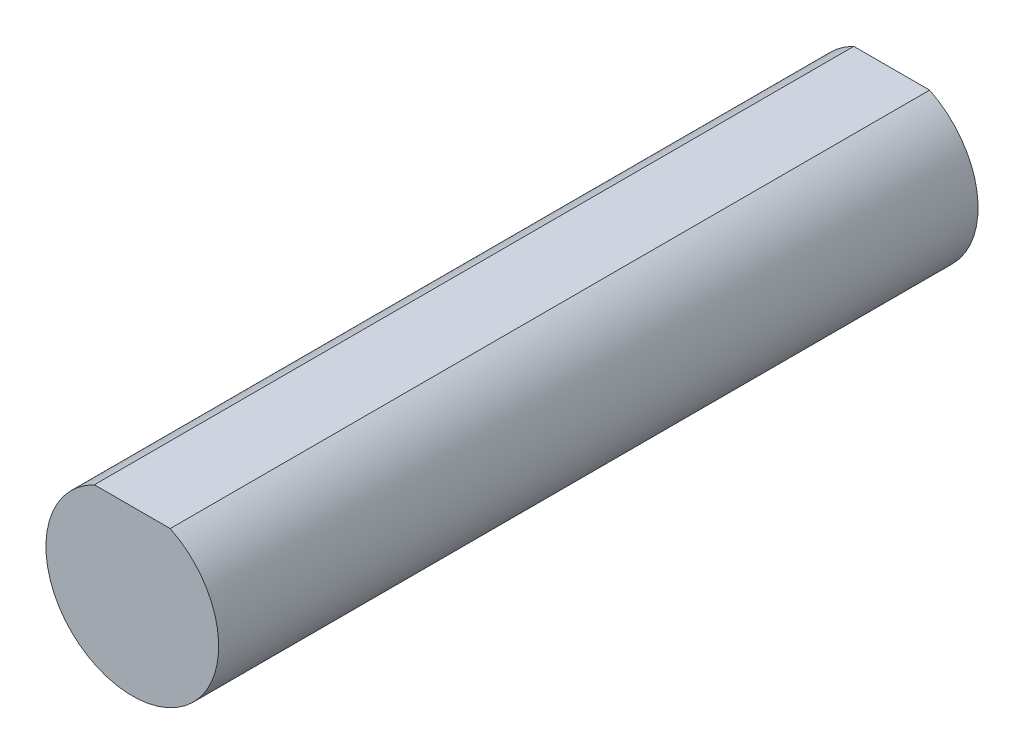
ISO-10303-21;
HEADER;
FILE_DESCRIPTION(('STEP AP214'),'2;1');
FILE_NAME('part.step','',(''),(''),'','','');
FILE_SCHEMA(('AUTOMOTIVE_DESIGN { 1 0 10303 214 1 1 1 1 }'));
ENDSEC;
DATA;
#1=APPLICATION_CONTEXT('core data for automotive mechanical design processes');
#2=APPLICATION_PROTOCOL_DEFINITION('international standard','automotive_design',2000,#1);
#3=PRODUCT_CONTEXT('',#1,'mechanical');
#4=PRODUCT('Part','Part','',(#3));
#5=PRODUCT_RELATED_PRODUCT_CATEGORY('part','',(#4));
#6=PRODUCT_DEFINITION_FORMATION('','',#4);
#7=PRODUCT_DEFINITION_CONTEXT('part definition',#1,'design');
#8=PRODUCT_DEFINITION('design','',#6,#7);
#9=PRODUCT_DEFINITION_SHAPE('','',#8);
#10=(LENGTH_UNIT() NAMED_UNIT(*) SI_UNIT(.MILLI.,.METRE.));
#11=(NAMED_UNIT(*) PLANE_ANGLE_UNIT() SI_UNIT($,.RADIAN.));
#12=(NAMED_UNIT(*) SI_UNIT($,.STERADIAN.) SOLID_ANGLE_UNIT());
#13=UNCERTAINTY_MEASURE_WITH_UNIT(LENGTH_MEASURE(1.E-05),#10,'distance_accuracy_value','');
#14=(GEOMETRIC_REPRESENTATION_CONTEXT(3) GLOBAL_UNCERTAINTY_ASSIGNED_CONTEXT((#13)) GLOBAL_UNIT_ASSIGNED_CONTEXT((#10,
#11,#12)) REPRESENTATION_CONTEXT('',''));
#15=CARTESIAN_POINT('',(0.,0.,0.));
#16=DIRECTION('',(0.,0.,1.));
#17=DIRECTION('',(1.,0.,0.));
#18=AXIS2_PLACEMENT_3D('',#15,#16,#17);
#19=CARTESIAN_POINT('',(0.,0.,21.9964));
#20=DIRECTION('',(0.,0.,-1.));
#21=DIRECTION('',(-1.,0.,0.));
#22=AXIS2_PLACEMENT_3D('',#19,#20,#21);
#23=CYLINDRICAL_SURFACE('',#22,2.5019);
#24=CARTESIAN_POINT('',(0.,0.,21.9964));
#25=DIRECTION('',(0.,0.,1.));
#26=DIRECTION('',(1.,0.,0.));
#27=AXIS2_PLACEMENT_3D('',#24,#25,#26);
#28=CIRCLE('',#27,2.5019);
#29=CARTESIAN_POINT('',(-1.09838481417034,2.2479,21.9964));
#30=VERTEX_POINT('',#29);
#31=CARTESIAN_POINT('',(1.09838481417034,2.2479,21.9964));
#32=VERTEX_POINT('',#31);
#33=EDGE_CURVE('E11',#30,#32,#28,.T.);
#34=ORIENTED_EDGE('',*,*,#33,.F.);
#35=DIRECTION('',(0.,0.,1.));
#36=VECTOR('',#35,1.);
#37=CARTESIAN_POINT('',(-1.09838481417034,2.2479,0.));
#38=LINE('',#37,#36);
#39=CARTESIAN_POINT('',(-1.09838481417034,2.2479,0.));
#40=VERTEX_POINT('',#39);
#41=EDGE_CURVE('E64',#40,#30,#38,.T.);
#42=ORIENTED_EDGE('',*,*,#41,.F.);
#43=CARTESIAN_POINT('',(0.,0.,0.));
#44=DIRECTION('',(0.,0.,1.));
#45=DIRECTION('',(1.,0.,0.));
#46=AXIS2_PLACEMENT_3D('',#43,#44,#45);
#47=CIRCLE('',#46,2.5019);
#48=CARTESIAN_POINT('',(1.09838481417034,2.2479,0.));
#49=VERTEX_POINT('',#48);
#50=EDGE_CURVE('E44',#40,#49,#47,.T.);
#51=ORIENTED_EDGE('',*,*,#50,.T.);
#52=DIRECTION('',(0.,0.,1.));
#53=VECTOR('',#52,1.);
#54=CARTESIAN_POINT('',(1.09838481417034,2.2479,0.));
#55=LINE('',#54,#53);
#56=EDGE_CURVE('E55',#49,#32,#55,.T.);
#57=ORIENTED_EDGE('',*,*,#56,.T.);
#58=EDGE_LOOP('',(#34,#42,#51,#57));
#59=FACE_BOUND('',#58,.T.);
#60=ADVANCED_FACE('F41',(#59),#23,.T.);
#61=CARTESIAN_POINT('',(0.,0.,21.9964));
#62=DIRECTION('',(0.,0.,1.));
#63=DIRECTION('',(1.,0.,0.));
#64=AXIS2_PLACEMENT_3D('',#61,#62,#63);
#65=PLANE('',#64);
#66=DIRECTION('',(1.,0.,0.));
#67=VECTOR('',#66,1.);
#68=CARTESIAN_POINT('',(-1.09838481417034,2.2479,21.9964));
#69=LINE('',#68,#67);
#70=EDGE_CURVE('E67',#30,#32,#69,.T.);
#71=ORIENTED_EDGE('',*,*,#70,.F.);
#72=ORIENTED_EDGE('',*,*,#33,.T.);
#73=EDGE_LOOP('',(#71,#72));
#74=FACE_BOUND('',#73,.T.);
#75=ADVANCED_FACE('F74',(#74),#65,.T.);
#76=CARTESIAN_POINT('',(0.,0.,0.));
#77=DIRECTION('',(0.,0.,1.));
#78=DIRECTION('',(1.,0.,0.));
#79=AXIS2_PLACEMENT_3D('',#76,#77,#78);
#80=PLANE('',#79);
#81=ORIENTED_EDGE('',*,*,#50,.F.);
#82=DIRECTION('',(1.,0.,0.));
#83=VECTOR('',#82,1.);
#84=CARTESIAN_POINT('',(-1.09838481417034,2.2479,0.));
#85=LINE('',#84,#83);
#86=EDGE_CURVE('E60',#40,#49,#85,.T.);
#87=ORIENTED_EDGE('',*,*,#86,.T.);
#88=EDGE_LOOP('',(#81,#87));
#89=FACE_BOUND('',#88,.T.);
#90=ADVANCED_FACE('F79',(#89),#80,.F.);
#91=CARTESIAN_POINT('',(-1.09838481417034,2.2479,0.));
#92=DIRECTION('',(0.,-1.,0.));
#93=DIRECTION('',(0.,0.,-1.));
#94=AXIS2_PLACEMENT_3D('',#91,#92,#93);
#95=PLANE('',#94);
#96=ORIENTED_EDGE('',*,*,#70,.T.);
#97=ORIENTED_EDGE('',*,*,#56,.F.);
#98=ORIENTED_EDGE('',*,*,#86,.F.);
#99=ORIENTED_EDGE('',*,*,#41,.T.);
#100=EDGE_LOOP('',(#96,#97,#98,#99));
#101=FACE_BOUND('',#100,.T.);
#102=ADVANCED_FACE('F66',(#101),#95,.F.);
#103=CLOSED_SHELL('',(#60,#75,#90,#102));
#104=MANIFOLD_SOLID_BREP('B2',#103);
#105=ADVANCED_BREP_SHAPE_REPRESENTATION('',(#18,#104),#14);
#106=SHAPE_DEFINITION_REPRESENTATION(#9,#105);
ENDSEC;
END-ISO-10303-21;
